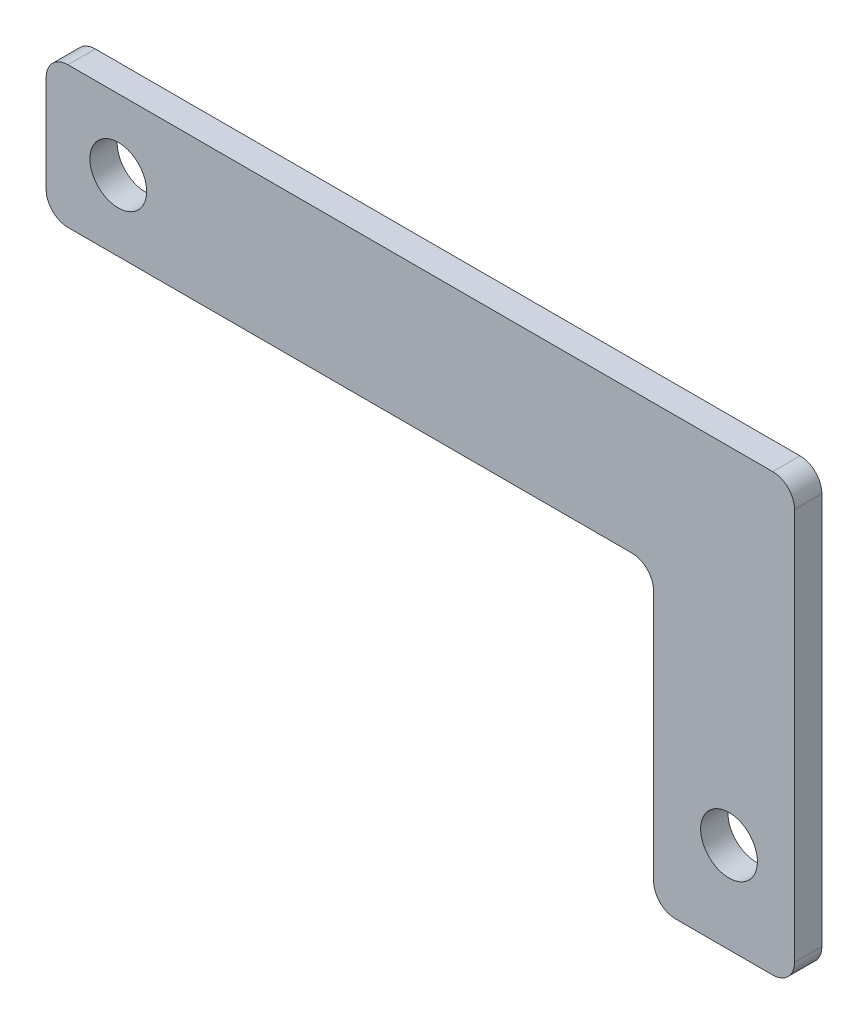
ISO-10303-21;
HEADER;
FILE_DESCRIPTION(('STEP AP214'),'2;1');
FILE_NAME('part.step','',(''),(''),'','','');
FILE_SCHEMA(('AUTOMOTIVE_DESIGN { 1 0 10303 214 1 1 1 1 }'));
ENDSEC;
DATA;
#1=APPLICATION_CONTEXT('core data for automotive mechanical design processes');
#2=APPLICATION_PROTOCOL_DEFINITION('international standard','automotive_design',2000,#1);
#3=PRODUCT_CONTEXT('',#1,'mechanical');
#4=PRODUCT('Part','Part','',(#3));
#5=PRODUCT_RELATED_PRODUCT_CATEGORY('part','',(#4));
#6=PRODUCT_DEFINITION_FORMATION('','',#4);
#7=PRODUCT_DEFINITION_CONTEXT('part definition',#1,'design');
#8=PRODUCT_DEFINITION('design','',#6,#7);
#9=PRODUCT_DEFINITION_SHAPE('','',#8);
#10=(LENGTH_UNIT() NAMED_UNIT(*) SI_UNIT(.MILLI.,.METRE.));
#11=(NAMED_UNIT(*) PLANE_ANGLE_UNIT() SI_UNIT($,.RADIAN.));
#12=(NAMED_UNIT(*) SI_UNIT($,.STERADIAN.) SOLID_ANGLE_UNIT());
#13=UNCERTAINTY_MEASURE_WITH_UNIT(LENGTH_MEASURE(1.E-05),#10,'distance_accuracy_value','');
#14=(GEOMETRIC_REPRESENTATION_CONTEXT(3) GLOBAL_UNCERTAINTY_ASSIGNED_CONTEXT((#13)) GLOBAL_UNIT_ASSIGNED_CONTEXT((#10,
#11,#12)) REPRESENTATION_CONTEXT('',''));
#15=CARTESIAN_POINT('',(0.,0.,0.));
#16=DIRECTION('',(0.,0.,1.));
#17=DIRECTION('',(1.,0.,0.));
#18=AXIS2_PLACEMENT_3D('',#15,#16,#17);
#19=CARTESIAN_POINT('',(-22.7939000000006,-78.501600001231,-3.175));
#20=DIRECTION('',(-1.,0.,0.));
#21=DIRECTION('',(0.,-1.,0.));
#22=AXIS2_PLACEMENT_3D('',#19,#20,#21);
#23=PLANE('',#22);
#24=DIRECTION('',(0.,-1.,0.));
#25=VECTOR('',#24,1.);
#26=CARTESIAN_POINT('',(-22.7939000000006,-78.501600001231,0.));
#27=LINE('',#26,#25);
#28=CARTESIAN_POINT('',(-22.7939000000006,-64.663600001231,0.));
#29=VERTEX_POINT('',#28);
#30=CARTESIAN_POINT('',(-22.7939000000006,-75.961600001231,0.));
#31=VERTEX_POINT('',#30);
#32=EDGE_CURVE('E201',#29,#31,#27,.T.);
#33=ORIENTED_EDGE('',*,*,#32,.F.);
#34=DIRECTION('',(0.,0.,1.));
#35=VECTOR('',#34,1.);
#36=CARTESIAN_POINT('',(-22.7939000000006,-64.663600001231,-3.175));
#37=LINE('',#36,#35);
#38=CARTESIAN_POINT('',(-22.7939000000006,-64.663600001231,-3.175));
#39=VERTEX_POINT('',#38);
#40=EDGE_CURVE('E279',#29,#39,#37,.F.);
#41=ORIENTED_EDGE('',*,*,#40,.T.);
#42=DIRECTION('',(0.,-1.,0.));
#43=VECTOR('',#42,1.);
#44=CARTESIAN_POINT('',(-22.7939000000006,-78.501600001231,-3.175));
#45=LINE('',#44,#43);
#46=CARTESIAN_POINT('',(-22.7939000000006,-75.961600001231,-3.175));
#47=VERTEX_POINT('',#46);
#48=EDGE_CURVE('E298',#39,#47,#45,.T.);
#49=ORIENTED_EDGE('',*,*,#48,.T.);
#50=DIRECTION('',(0.,0.,1.));
#51=VECTOR('',#50,1.);
#52=CARTESIAN_POINT('',(-22.7939000000006,-75.961600001231,-3.175));
#53=LINE('',#52,#51);
#54=EDGE_CURVE('E275',#47,#31,#53,.T.);
#55=ORIENTED_EDGE('',*,*,#54,.T.);
#56=EDGE_LOOP('',(#33,#41,#49,#55));
#57=FACE_BOUND('',#56,.T.);
#58=ADVANCED_FACE('F47',(#57),#23,.T.);
#59=CARTESIAN_POINT('',(64.1795690476214,-62.123600001232,-3.175));
#60=DIRECTION('',(0.,1.,0.));
#61=DIRECTION('',(-1.,0.,0.));
#62=AXIS2_PLACEMENT_3D('',#59,#60,#61);
#63=PLANE('',#62);
#64=DIRECTION('',(-1.,0.,0.));
#65=VECTOR('',#64,1.);
#66=CARTESIAN_POINT('',(64.1795690476214,-62.123600001232,0.));
#67=LINE('',#66,#65);
#68=CARTESIAN_POINT('',(61.6395690476214,-62.123600001232,0.));
#69=VERTEX_POINT('',#68);
#70=CARTESIAN_POINT('',(-20.2539000000005,-62.123600001231,0.));
#71=VERTEX_POINT('',#70);
#72=EDGE_CURVE('E159',#69,#71,#67,.T.);
#73=ORIENTED_EDGE('',*,*,#72,.F.);
#74=DIRECTION('',(0.,0.,1.));
#75=VECTOR('',#74,1.);
#76=CARTESIAN_POINT('',(61.6395690476214,-62.123600001232,-3.175));
#77=LINE('',#76,#75);
#78=CARTESIAN_POINT('',(61.6395690476214,-62.123600001232,-3.175));
#79=VERTEX_POINT('',#78);
#80=EDGE_CURVE('E239',#69,#79,#77,.F.);
#81=ORIENTED_EDGE('',*,*,#80,.T.);
#82=DIRECTION('',(-1.,0.,0.));
#83=VECTOR('',#82,1.);
#84=CARTESIAN_POINT('',(64.1795690476214,-62.123600001232,-3.175));
#85=LINE('',#84,#83);
#86=CARTESIAN_POINT('',(-20.2539000000005,-62.123600001231,-3.175));
#87=VERTEX_POINT('',#86);
#88=EDGE_CURVE('E165',#79,#87,#85,.T.);
#89=ORIENTED_EDGE('',*,*,#88,.T.);
#90=DIRECTION('',(0.,0.,1.));
#91=VECTOR('',#90,1.);
#92=CARTESIAN_POINT('',(-20.2539000000005,-62.123600001231,-3.175));
#93=LINE('',#92,#91);
#94=EDGE_CURVE('E232',#87,#71,#93,.T.);
#95=ORIENTED_EDGE('',*,*,#94,.T.);
#96=EDGE_LOOP('',(#73,#81,#89,#95));
#97=FACE_BOUND('',#96,.T.);
#98=ADVANCED_FACE('F319',(#97),#63,.T.);
#99=CARTESIAN_POINT('',(64.1795690476214,-62.123600001232,-3.175));
#100=DIRECTION('',(1.,0.,0.));
#101=DIRECTION('',(0.,1.,0.));
#102=AXIS2_PLACEMENT_3D('',#99,#100,#101);
#103=PLANE('',#102);
#104=DIRECTION('',(0.,1.,0.));
#105=VECTOR('',#104,1.);
#106=CARTESIAN_POINT('',(64.1795690476214,-62.123600001232,-3.175));
#107=LINE('',#106,#105);
#108=CARTESIAN_POINT('',(64.1795690476214,-110.251600001232,-3.175));
#109=VERTEX_POINT('',#108);
#110=CARTESIAN_POINT('',(64.1795690476214,-64.663600001232,-3.175));
#111=VERTEX_POINT('',#110);
#112=EDGE_CURVE('E172',#109,#111,#107,.T.);
#113=ORIENTED_EDGE('',*,*,#112,.T.);
#114=DIRECTION('',(0.,0.,1.));
#115=VECTOR('',#114,1.);
#116=CARTESIAN_POINT('',(64.1795690476214,-64.663600001232,-3.175));
#117=LINE('',#116,#115);
#118=CARTESIAN_POINT('',(64.1795690476214,-64.663600001232,0.));
#119=VERTEX_POINT('',#118);
#120=EDGE_CURVE('E157',#111,#119,#117,.T.);
#121=ORIENTED_EDGE('',*,*,#120,.T.);
#122=DIRECTION('',(0.,1.,0.));
#123=VECTOR('',#122,1.);
#124=CARTESIAN_POINT('',(64.1795690476214,-62.123600001232,0.));
#125=LINE('',#124,#123);
#126=CARTESIAN_POINT('',(64.1795690476214,-110.251600001232,0.));
#127=VERTEX_POINT('',#126);
#128=EDGE_CURVE('E140',#127,#119,#125,.T.);
#129=ORIENTED_EDGE('',*,*,#128,.F.);
#130=DIRECTION('',(0.,0.,1.));
#131=VECTOR('',#130,1.);
#132=CARTESIAN_POINT('',(64.1795690476214,-110.251600001232,-3.175));
#133=LINE('',#132,#131);
#134=EDGE_CURVE('E154',#127,#109,#133,.F.);
#135=ORIENTED_EDGE('',*,*,#134,.T.);
#136=EDGE_LOOP('',(#113,#121,#129,#135));
#137=FACE_BOUND('',#136,.T.);
#138=ADVANCED_FACE('F153',(#137),#103,.T.);
#139=CARTESIAN_POINT('',(64.1795690476214,-112.791600001232,-3.175));
#140=DIRECTION('',(0.,-1.,0.));
#141=DIRECTION('',(0.,0.,-1.));
#142=AXIS2_PLACEMENT_3D('',#139,#140,#141);
#143=PLANE('',#142);
#144=DIRECTION('',(1.,0.,0.));
#145=VECTOR('',#144,1.);
#146=CARTESIAN_POINT('',(64.1795690476214,-112.791600001232,-3.175));
#147=LINE('',#146,#145);
#148=CARTESIAN_POINT('',(50.3415690476214,-112.791600001232,-3.175));
#149=VERTEX_POINT('',#148);
#150=CARTESIAN_POINT('',(61.6395690476214,-112.791600001232,-3.175));
#151=VERTEX_POINT('',#150);
#152=EDGE_CURVE('E302',#149,#151,#147,.T.);
#153=ORIENTED_EDGE('',*,*,#152,.T.);
#154=DIRECTION('',(0.,0.,1.));
#155=VECTOR('',#154,1.);
#156=CARTESIAN_POINT('',(61.6395690476214,-112.791600001232,-3.175));
#157=LINE('',#156,#155);
#158=CARTESIAN_POINT('',(61.6395690476214,-112.791600001232,0.));
#159=VERTEX_POINT('',#158);
#160=EDGE_CURVE('E272',#151,#159,#157,.T.);
#161=ORIENTED_EDGE('',*,*,#160,.T.);
#162=DIRECTION('',(1.,0.,0.));
#163=VECTOR('',#162,1.);
#164=CARTESIAN_POINT('',(64.1795690476214,-112.791600001232,0.));
#165=LINE('',#164,#163);
#166=CARTESIAN_POINT('',(50.3415690476214,-112.791600001232,0.));
#167=VERTEX_POINT('',#166);
#168=EDGE_CURVE('E142',#167,#159,#165,.T.);
#169=ORIENTED_EDGE('',*,*,#168,.F.);
#170=DIRECTION('',(0.,0.,1.));
#171=VECTOR('',#170,1.);
#172=CARTESIAN_POINT('',(50.3415690476214,-112.791600001232,-3.175));
#173=LINE('',#172,#171);
#174=EDGE_CURVE('E269',#167,#149,#173,.F.);
#175=ORIENTED_EDGE('',*,*,#174,.T.);
#176=EDGE_LOOP('',(#153,#161,#169,#175));
#177=FACE_BOUND('',#176,.T.);
#178=ADVANCED_FACE('F406',(#177),#143,.T.);
#179=CARTESIAN_POINT('',(47.8015690476214,-78.501600001232,-3.175));
#180=DIRECTION('',(-1.,0.,0.));
#181=DIRECTION('',(0.,-1.,0.));
#182=AXIS2_PLACEMENT_3D('',#179,#180,#181);
#183=PLANE('',#182);
#184=DIRECTION('',(0.,-1.,0.));
#185=VECTOR('',#184,1.);
#186=CARTESIAN_POINT('',(47.8015690476214,-78.501600001232,0.));
#187=LINE('',#186,#185);
#188=CARTESIAN_POINT('',(47.8015690476214,-81.041600001232,0.));
#189=VERTEX_POINT('',#188);
#190=CARTESIAN_POINT('',(47.8015690476214,-110.251600001232,0.));
#191=VERTEX_POINT('',#190);
#192=EDGE_CURVE('E200',#189,#191,#187,.T.);
#193=ORIENTED_EDGE('',*,*,#192,.F.);
#194=DIRECTION('',(0.,0.,1.));
#195=VECTOR('',#194,1.);
#196=CARTESIAN_POINT('',(47.8015690476214,-81.041600001232,-3.175));
#197=LINE('',#196,#195);
#198=CARTESIAN_POINT('',(47.8015690476214,-81.041600001232,-3.175));
#199=VERTEX_POINT('',#198);
#200=EDGE_CURVE('E266',#189,#199,#197,.F.);
#201=ORIENTED_EDGE('',*,*,#200,.T.);
#202=DIRECTION('',(0.,-1.,0.));
#203=VECTOR('',#202,1.);
#204=CARTESIAN_POINT('',(47.8015690476214,-78.501600001232,-3.175));
#205=LINE('',#204,#203);
#206=CARTESIAN_POINT('',(47.8015690476214,-110.251600001232,-3.175));
#207=VERTEX_POINT('',#206);
#208=EDGE_CURVE('E297',#199,#207,#205,.T.);
#209=ORIENTED_EDGE('',*,*,#208,.T.);
#210=DIRECTION('',(0.,0.,1.));
#211=VECTOR('',#210,1.);
#212=CARTESIAN_POINT('',(47.8015690476214,-110.251600001232,-3.175));
#213=LINE('',#212,#211);
#214=EDGE_CURVE('E262',#207,#191,#213,.T.);
#215=ORIENTED_EDGE('',*,*,#214,.T.);
#216=EDGE_LOOP('',(#193,#201,#209,#215));
#217=FACE_BOUND('',#216,.T.);
#218=ADVANCED_FACE('F288',(#217),#183,.T.);
#219=CARTESIAN_POINT('',(47.8015690476214,-78.501600001232,-3.175));
#220=DIRECTION('',(0.,-1.,0.));
#221=DIRECTION('',(1.,0.,0.));
#222=AXIS2_PLACEMENT_3D('',#219,#220,#221);
#223=PLANE('',#222);
#224=DIRECTION('',(1.,0.,0.));
#225=VECTOR('',#224,1.);
#226=CARTESIAN_POINT('',(47.8015690476214,-78.501600001232,-3.175));
#227=LINE('',#226,#225);
#228=CARTESIAN_POINT('',(-20.2539000000006,-78.501600001231,-3.175));
#229=VERTEX_POINT('',#228);
#230=CARTESIAN_POINT('',(45.2615690476214,-78.5016000012319,-3.175));
#231=VERTEX_POINT('',#230);
#232=EDGE_CURVE('E294',#229,#231,#227,.T.);
#233=ORIENTED_EDGE('',*,*,#232,.T.);
#234=DIRECTION('',(0.,0.,1.));
#235=VECTOR('',#234,1.);
#236=CARTESIAN_POINT('',(45.2615690476214,-78.5016000012319,0.));
#237=LINE('',#236,#235);
#238=CARTESIAN_POINT('',(45.2615690476214,-78.5016000012319,0.));
#239=VERTEX_POINT('',#238);
#240=EDGE_CURVE('E258',#231,#239,#237,.T.);
#241=ORIENTED_EDGE('',*,*,#240,.T.);
#242=DIRECTION('',(1.,0.,0.));
#243=VECTOR('',#242,1.);
#244=CARTESIAN_POINT('',(47.8015690476214,-78.501600001232,0.));
#245=LINE('',#244,#243);
#246=CARTESIAN_POINT('',(-20.2539000000006,-78.501600001231,0.));
#247=VERTEX_POINT('',#246);
#248=EDGE_CURVE('E196',#247,#239,#245,.T.);
#249=ORIENTED_EDGE('',*,*,#248,.F.);
#250=DIRECTION('',(0.,0.,1.));
#251=VECTOR('',#250,1.);
#252=CARTESIAN_POINT('',(-20.2539000000006,-78.501600001231,-3.175));
#253=LINE('',#252,#251);
#254=EDGE_CURVE('E68',#247,#229,#253,.F.);
#255=ORIENTED_EDGE('',*,*,#254,.T.);
#256=EDGE_LOOP('',(#233,#241,#249,#255));
#257=FACE_BOUND('',#256,.T.);
#258=ADVANCED_FACE('F293',(#257),#223,.T.);
#259=CARTESIAN_POINT('',(0.,0.,-3.175));
#260=DIRECTION('',(0.,0.,1.));
#261=DIRECTION('',(1.,0.,0.));
#262=AXIS2_PLACEMENT_3D('',#259,#260,#261);
#263=PLANE('',#262);
#264=CARTESIAN_POINT('',(56.5659190476221,-102.268610497746,-3.175));
#265=DIRECTION('',(0.,0.,1.));
#266=DIRECTION('',(1.,0.,0.));
#267=AXIS2_PLACEMENT_3D('',#264,#265,#266);
#268=CIRCLE('',#267,3.3);
#269=CARTESIAN_POINT('',(59.8659190476221,-102.268610497746,-3.175));
#270=VERTEX_POINT('',#269);
#271=EDGE_CURVE('E332',#270,#270,#268,.T.);
#272=ORIENTED_EDGE('',*,*,#271,.T.);
#273=EDGE_LOOP('',(#272));
#274=FACE_BOUND('',#273,.T.);
#275=CARTESIAN_POINT('',(-14.4119000000007,-70.312600001232,-3.175));
#276=DIRECTION('',(0.,0.,1.));
#277=DIRECTION('',(1.,0.,0.));
#278=AXIS2_PLACEMENT_3D('',#275,#276,#277);
#279=CIRCLE('',#278,3.3);
#280=CARTESIAN_POINT('',(-11.1119000000007,-70.312600001232,-3.175));
#281=VERTEX_POINT('',#280);
#282=EDGE_CURVE('E326',#281,#281,#279,.T.);
#283=ORIENTED_EDGE('',*,*,#282,.T.);
#284=EDGE_LOOP('',(#283));
#285=FACE_BOUND('',#284,.T.);
#286=ORIENTED_EDGE('',*,*,#88,.F.);
#287=CARTESIAN_POINT('',(61.6395690476214,-64.663600001232,-3.175));
#288=DIRECTION('',(0.,0.,1.));
#289=DIRECTION('',(1.,0.,0.));
#290=AXIS2_PLACEMENT_3D('',#287,#288,#289);
#291=CIRCLE('',#290,2.54);
#292=EDGE_CURVE('E253',#79,#111,#291,.F.);
#293=ORIENTED_EDGE('',*,*,#292,.T.);
#294=ORIENTED_EDGE('',*,*,#112,.F.);
#295=CARTESIAN_POINT('',(61.6395690476214,-110.251600001232,-3.175));
#296=DIRECTION('',(0.,0.,1.));
#297=DIRECTION('',(1.,0.,0.));
#298=AXIS2_PLACEMENT_3D('',#295,#296,#297);
#299=CIRCLE('',#298,2.54);
#300=EDGE_CURVE('E163',#109,#151,#299,.F.);
#301=ORIENTED_EDGE('',*,*,#300,.T.);
#302=ORIENTED_EDGE('',*,*,#152,.F.);
#303=CARTESIAN_POINT('',(50.3415690476214,-110.251600001232,-3.175));
#304=DIRECTION('',(0.,0.,1.));
#305=DIRECTION('',(1.,0.,0.));
#306=AXIS2_PLACEMENT_3D('',#303,#304,#305);
#307=CIRCLE('',#306,2.54);
#308=EDGE_CURVE('E248',#149,#207,#307,.F.);
#309=ORIENTED_EDGE('',*,*,#308,.T.);
#310=ORIENTED_EDGE('',*,*,#208,.F.);
#311=CARTESIAN_POINT('',(45.2615690476214,-81.041600001232,-3.175));
#312=DIRECTION('',(0.,0.,1.));
#313=DIRECTION('',(1.,0.,0.));
#314=AXIS2_PLACEMENT_3D('',#311,#312,#313);
#315=CIRCLE('',#314,2.54);
#316=EDGE_CURVE('E12',#199,#231,#315,.T.);
#317=ORIENTED_EDGE('',*,*,#316,.T.);
#318=ORIENTED_EDGE('',*,*,#232,.F.);
#319=CARTESIAN_POINT('',(-20.2539000000006,-75.961600001231,-3.175));
#320=DIRECTION('',(0.,0.,1.));
#321=DIRECTION('',(1.,0.,0.));
#322=AXIS2_PLACEMENT_3D('',#319,#320,#321);
#323=CIRCLE('',#322,2.54);
#324=EDGE_CURVE('E242',#229,#47,#323,.F.);
#325=ORIENTED_EDGE('',*,*,#324,.T.);
#326=ORIENTED_EDGE('',*,*,#48,.F.);
#327=CARTESIAN_POINT('',(-20.2539000000006,-64.663600001231,-3.175));
#328=DIRECTION('',(0.,0.,1.));
#329=DIRECTION('',(1.,0.,0.));
#330=AXIS2_PLACEMENT_3D('',#327,#328,#329);
#331=CIRCLE('',#330,2.54);
#332=EDGE_CURVE('E245',#39,#87,#331,.F.);
#333=ORIENTED_EDGE('',*,*,#332,.T.);
#334=EDGE_LOOP('',(#286,#293,#294,#301,#302,#309,#310,#317,#318,#325,#326,#333));
#335=FACE_BOUND('',#334,.T.);
#336=ADVANCED_FACE('F351',(#274,#285,#335),#263,.F.);
#337=CARTESIAN_POINT('',(0.,0.,0.));
#338=DIRECTION('',(0.,0.,1.));
#339=DIRECTION('',(1.,0.,0.));
#340=AXIS2_PLACEMENT_3D('',#337,#338,#339);
#341=PLANE('',#340);
#342=CARTESIAN_POINT('',(56.5659190476221,-102.268610497746,0.));
#343=DIRECTION('',(0.,0.,1.));
#344=DIRECTION('',(1.,0.,0.));
#345=AXIS2_PLACEMENT_3D('',#342,#343,#344);
#346=CIRCLE('',#345,3.3);
#347=CARTESIAN_POINT('',(59.8659190476221,-102.268610497746,0.));
#348=VERTEX_POINT('',#347);
#349=EDGE_CURVE('E335',#348,#348,#346,.T.);
#350=ORIENTED_EDGE('',*,*,#349,.F.);
#351=EDGE_LOOP('',(#350));
#352=FACE_BOUND('',#351,.T.);
#353=CARTESIAN_POINT('',(-14.4119000000007,-70.312600001232,0.));
#354=DIRECTION('',(0.,0.,1.));
#355=DIRECTION('',(1.,0.,0.));
#356=AXIS2_PLACEMENT_3D('',#353,#354,#355);
#357=CIRCLE('',#356,3.3);
#358=CARTESIAN_POINT('',(-11.1119000000007,-70.312600001232,0.));
#359=VERTEX_POINT('',#358);
#360=EDGE_CURVE('E329',#359,#359,#357,.T.);
#361=ORIENTED_EDGE('',*,*,#360,.F.);
#362=EDGE_LOOP('',(#361));
#363=FACE_BOUND('',#362,.T.);
#364=ORIENTED_EDGE('',*,*,#128,.T.);
#365=CARTESIAN_POINT('',(61.6395690476214,-64.663600001232,0.));
#366=DIRECTION('',(0.,0.,1.));
#367=DIRECTION('',(1.,0.,0.));
#368=AXIS2_PLACEMENT_3D('',#365,#366,#367);
#369=CIRCLE('',#368,2.54);
#370=EDGE_CURVE('E148',#119,#69,#369,.T.);
#371=ORIENTED_EDGE('',*,*,#370,.T.);
#372=ORIENTED_EDGE('',*,*,#72,.T.);
#373=CARTESIAN_POINT('',(-20.2539000000006,-64.663600001231,0.));
#374=DIRECTION('',(0.,0.,1.));
#375=DIRECTION('',(1.,0.,0.));
#376=AXIS2_PLACEMENT_3D('',#373,#374,#375);
#377=CIRCLE('',#376,2.54);
#378=EDGE_CURVE('E180',#71,#29,#377,.T.);
#379=ORIENTED_EDGE('',*,*,#378,.T.);
#380=ORIENTED_EDGE('',*,*,#32,.T.);
#381=CARTESIAN_POINT('',(-20.2539000000006,-75.961600001231,0.));
#382=DIRECTION('',(0.,0.,1.));
#383=DIRECTION('',(1.,0.,0.));
#384=AXIS2_PLACEMENT_3D('',#381,#382,#383);
#385=CIRCLE('',#384,2.54);
#386=EDGE_CURVE('E169',#31,#247,#385,.T.);
#387=ORIENTED_EDGE('',*,*,#386,.T.);
#388=ORIENTED_EDGE('',*,*,#248,.T.);
#389=CARTESIAN_POINT('',(45.2615690476214,-81.041600001232,0.));
#390=DIRECTION('',(0.,0.,1.));
#391=DIRECTION('',(1.,0.,0.));
#392=AXIS2_PLACEMENT_3D('',#389,#390,#391);
#393=CIRCLE('',#392,2.54);
#394=EDGE_CURVE('E56',#239,#189,#393,.F.);
#395=ORIENTED_EDGE('',*,*,#394,.T.);
#396=ORIENTED_EDGE('',*,*,#192,.T.);
#397=CARTESIAN_POINT('',(50.3415690476214,-110.251600001232,0.));
#398=DIRECTION('',(0.,0.,1.));
#399=DIRECTION('',(1.,0.,0.));
#400=AXIS2_PLACEMENT_3D('',#397,#398,#399);
#401=CIRCLE('',#400,2.54);
#402=EDGE_CURVE('E149',#191,#167,#401,.T.);
#403=ORIENTED_EDGE('',*,*,#402,.T.);
#404=ORIENTED_EDGE('',*,*,#168,.T.);
#405=CARTESIAN_POINT('',(61.6395690476214,-110.251600001232,0.));
#406=DIRECTION('',(0.,0.,1.));
#407=DIRECTION('',(1.,0.,0.));
#408=AXIS2_PLACEMENT_3D('',#405,#406,#407);
#409=CIRCLE('',#408,2.54);
#410=EDGE_CURVE('E137',#159,#127,#409,.T.);
#411=ORIENTED_EDGE('',*,*,#410,.T.);
#412=EDGE_LOOP('',(#364,#371,#372,#379,#380,#387,#388,#395,#396,#403,#404,#411));
#413=FACE_BOUND('',#412,.T.);
#414=ADVANCED_FACE('F139',(#352,#363,#413),#341,.T.);
#415=CARTESIAN_POINT('',(-14.4119000000007,-70.312600001232,0.));
#416=DIRECTION('',(0.,0.,1.));
#417=DIRECTION('',(1.,0.,0.));
#418=AXIS2_PLACEMENT_3D('',#415,#416,#417);
#419=CYLINDRICAL_SURFACE('',#418,3.3);
#420=ORIENTED_EDGE('',*,*,#282,.F.);
#421=EDGE_LOOP('',(#420));
#422=FACE_BOUND('',#421,.T.);
#423=ORIENTED_EDGE('',*,*,#360,.T.);
#424=EDGE_LOOP('',(#423));
#425=FACE_BOUND('',#424,.T.);
#426=ADVANCED_FACE('F350',(#422,#425),#419,.F.);
#427=CARTESIAN_POINT('',(56.5659190476221,-102.268610497746,0.));
#428=DIRECTION('',(0.,0.,1.));
#429=DIRECTION('',(1.,0.,0.));
#430=AXIS2_PLACEMENT_3D('',#427,#428,#429);
#431=CYLINDRICAL_SURFACE('',#430,3.3);
#432=ORIENTED_EDGE('',*,*,#271,.F.);
#433=EDGE_LOOP('',(#432));
#434=FACE_BOUND('',#433,.T.);
#435=ORIENTED_EDGE('',*,*,#349,.T.);
#436=EDGE_LOOP('',(#435));
#437=FACE_BOUND('',#436,.T.);
#438=ADVANCED_FACE('F346',(#434,#437),#431,.F.);
#439=CARTESIAN_POINT('',(61.6395690476214,-64.663600001232,-3.175));
#440=DIRECTION('',(0.,0.,1.));
#441=DIRECTION('',(1.,0.,0.));
#442=AXIS2_PLACEMENT_3D('',#439,#440,#441);
#443=CYLINDRICAL_SURFACE('',#442,2.54);
#444=ORIENTED_EDGE('',*,*,#292,.F.);
#445=ORIENTED_EDGE('',*,*,#80,.F.);
#446=ORIENTED_EDGE('',*,*,#370,.F.);
#447=ORIENTED_EDGE('',*,*,#120,.F.);
#448=EDGE_LOOP('',(#444,#445,#446,#447));
#449=FACE_BOUND('',#448,.T.);
#450=ADVANCED_FACE('F314',(#449),#443,.T.);
#451=CARTESIAN_POINT('',(45.2615690476214,-81.041600001232,-3.175));
#452=DIRECTION('',(0.,0.,-1.));
#453=DIRECTION('',(-1.,0.,0.));
#454=AXIS2_PLACEMENT_3D('',#451,#452,#453);
#455=CYLINDRICAL_SURFACE('',#454,2.54);
#456=ORIENTED_EDGE('',*,*,#316,.F.);
#457=ORIENTED_EDGE('',*,*,#200,.F.);
#458=ORIENTED_EDGE('',*,*,#394,.F.);
#459=ORIENTED_EDGE('',*,*,#240,.F.);
#460=EDGE_LOOP('',(#456,#457,#458,#459));
#461=FACE_BOUND('',#460,.T.);
#462=ADVANCED_FACE('F292',(#461),#455,.F.);
#463=CARTESIAN_POINT('',(61.6395690476214,-110.251600001232,-3.175));
#464=DIRECTION('',(0.,0.,1.));
#465=DIRECTION('',(1.,0.,0.));
#466=AXIS2_PLACEMENT_3D('',#463,#464,#465);
#467=CYLINDRICAL_SURFACE('',#466,2.54);
#468=ORIENTED_EDGE('',*,*,#300,.F.);
#469=ORIENTED_EDGE('',*,*,#134,.F.);
#470=ORIENTED_EDGE('',*,*,#410,.F.);
#471=ORIENTED_EDGE('',*,*,#160,.F.);
#472=EDGE_LOOP('',(#468,#469,#470,#471));
#473=FACE_BOUND('',#472,.T.);
#474=ADVANCED_FACE('F162',(#473),#467,.T.);
#475=CARTESIAN_POINT('',(50.3415690476214,-110.251600001232,-3.175));
#476=DIRECTION('',(0.,0.,1.));
#477=DIRECTION('',(1.,0.,0.));
#478=AXIS2_PLACEMENT_3D('',#475,#476,#477);
#479=CYLINDRICAL_SURFACE('',#478,2.54);
#480=ORIENTED_EDGE('',*,*,#308,.F.);
#481=ORIENTED_EDGE('',*,*,#174,.F.);
#482=ORIENTED_EDGE('',*,*,#402,.F.);
#483=ORIENTED_EDGE('',*,*,#214,.F.);
#484=EDGE_LOOP('',(#480,#481,#482,#483));
#485=FACE_BOUND('',#484,.T.);
#486=ADVANCED_FACE('F382',(#485),#479,.T.);
#487=CARTESIAN_POINT('',(-20.2539000000006,-64.663600001231,-3.175));
#488=DIRECTION('',(0.,0.,1.));
#489=DIRECTION('',(1.,0.,0.));
#490=AXIS2_PLACEMENT_3D('',#487,#488,#489);
#491=CYLINDRICAL_SURFACE('',#490,2.54);
#492=ORIENTED_EDGE('',*,*,#332,.F.);
#493=ORIENTED_EDGE('',*,*,#40,.F.);
#494=ORIENTED_EDGE('',*,*,#378,.F.);
#495=ORIENTED_EDGE('',*,*,#94,.F.);
#496=EDGE_LOOP('',(#492,#493,#494,#495));
#497=FACE_BOUND('',#496,.T.);
#498=ADVANCED_FACE('F384',(#497),#491,.T.);
#499=CARTESIAN_POINT('',(-20.2539000000006,-75.961600001231,-3.175));
#500=DIRECTION('',(0.,0.,1.));
#501=DIRECTION('',(1.,0.,0.));
#502=AXIS2_PLACEMENT_3D('',#499,#500,#501);
#503=CYLINDRICAL_SURFACE('',#502,2.54);
#504=ORIENTED_EDGE('',*,*,#324,.F.);
#505=ORIENTED_EDGE('',*,*,#254,.F.);
#506=ORIENTED_EDGE('',*,*,#386,.F.);
#507=ORIENTED_EDGE('',*,*,#54,.F.);
#508=EDGE_LOOP('',(#504,#505,#506,#507));
#509=FACE_BOUND('',#508,.T.);
#510=ADVANCED_FACE('F49',(#509),#503,.T.);
#511=CLOSED_SHELL('',(#58,#98,#138,#178,#218,#258,#336,#414,#426,#438,#450,#462,#474,#486,#498,#510));
#512=MANIFOLD_SOLID_BREP('B2',#511);
#513=ADVANCED_BREP_SHAPE_REPRESENTATION('',(#18,#512),#14);
#514=SHAPE_DEFINITION_REPRESENTATION(#9,#513);
ENDSEC;
END-ISO-10303-21;
